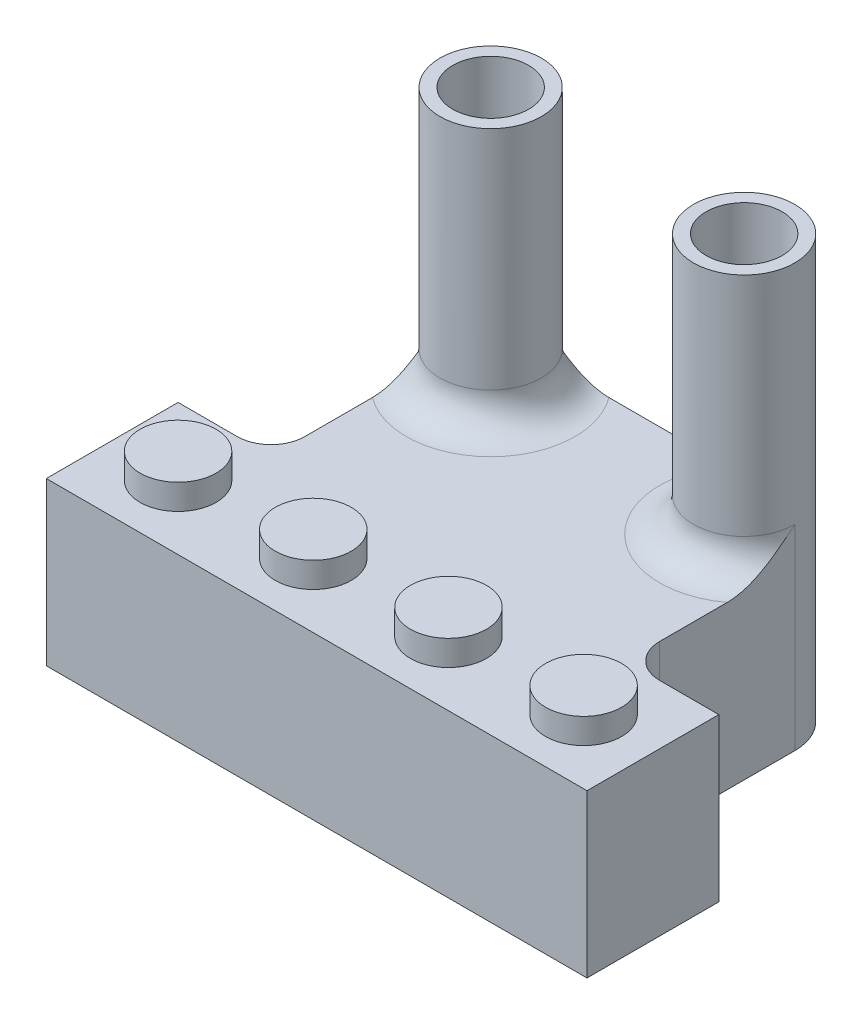
ISO-10303-21;
HEADER;
FILE_DESCRIPTION(('STEP AP214'),'2;1');
FILE_NAME('part.step','',(''),(''),'','','');
FILE_SCHEMA(('AUTOMOTIVE_DESIGN { 1 0 10303 214 1 1 1 1 }'));
ENDSEC;
DATA;
#1=APPLICATION_CONTEXT('core data for automotive mechanical design processes');
#2=APPLICATION_PROTOCOL_DEFINITION('international standard','automotive_design',2000,#1);
#3=PRODUCT_CONTEXT('',#1,'mechanical');
#4=PRODUCT('Part','Part','',(#3));
#5=PRODUCT_RELATED_PRODUCT_CATEGORY('part','',(#4));
#6=PRODUCT_DEFINITION_FORMATION('','',#4);
#7=PRODUCT_DEFINITION_CONTEXT('part definition',#1,'design');
#8=PRODUCT_DEFINITION('design','',#6,#7);
#9=PRODUCT_DEFINITION_SHAPE('','',#8);
#10=(LENGTH_UNIT() NAMED_UNIT(*) SI_UNIT(.MILLI.,.METRE.));
#11=(NAMED_UNIT(*) PLANE_ANGLE_UNIT() SI_UNIT($,.RADIAN.));
#12=(NAMED_UNIT(*) SI_UNIT($,.STERADIAN.) SOLID_ANGLE_UNIT());
#13=UNCERTAINTY_MEASURE_WITH_UNIT(LENGTH_MEASURE(1.E-05),#10,'distance_accuracy_value','');
#14=(GEOMETRIC_REPRESENTATION_CONTEXT(3) GLOBAL_UNCERTAINTY_ASSIGNED_CONTEXT((#13)) GLOBAL_UNIT_ASSIGNED_CONTEXT((#10,
#11,#12)) REPRESENTATION_CONTEXT('',''));
#15=CARTESIAN_POINT('',(0.,0.,0.));
#16=DIRECTION('',(0.,0.,1.));
#17=DIRECTION('',(1.,0.,0.));
#18=AXIS2_PLACEMENT_3D('',#15,#16,#17);
#19=CARTESIAN_POINT('',(236.873836495771,9.27344124698602,-50.3698911744964));
#20=DIRECTION('',(0.,0.,-1.));
#21=DIRECTION('',(-1.,0.,0.));
#22=AXIS2_PLACEMENT_3D('',#19,#20,#21);
#23=PLANE('',#22);
#24=DIRECTION('',(1.,0.,0.));
#25=VECTOR('',#24,1.);
#26=CARTESIAN_POINT('',(236.873836495771,-0.32655875301398,-50.3698911744964));
#27=LINE('',#26,#25);
#28=CARTESIAN_POINT('',(265.373836495771,-0.32655875301398,-50.3698911744964));
#29=VERTEX_POINT('',#28);
#30=CARTESIAN_POINT('',(268.873836495771,-0.32655875301398,-50.3698911744964));
#31=VERTEX_POINT('',#30);
#32=EDGE_CURVE('E344',#29,#31,#27,.T.);
#33=ORIENTED_EDGE('',*,*,#32,.F.);
#34=DIRECTION('',(0.,-1.,0.));
#35=VECTOR('',#34,1.);
#36=CARTESIAN_POINT('',(265.373836495771,9.27344124698602,-50.3698911744964));
#37=LINE('',#36,#35);
#38=CARTESIAN_POINT('',(265.373836495771,9.27344124698602,-50.3698911744964));
#39=VERTEX_POINT('',#38);
#40=EDGE_CURVE('E373',#29,#39,#37,.F.);
#41=ORIENTED_EDGE('',*,*,#40,.T.);
#42=DIRECTION('',(1.,0.,0.));
#43=VECTOR('',#42,1.);
#44=CARTESIAN_POINT('',(236.873836495771,9.27344124698602,-50.3698911744964));
#45=LINE('',#44,#43);
#46=CARTESIAN_POINT('',(268.873836495771,9.27344124698602,-50.3698911744964));
#47=VERTEX_POINT('',#46);
#48=EDGE_CURVE('E331',#39,#47,#45,.T.);
#49=ORIENTED_EDGE('',*,*,#48,.T.);
#50=DIRECTION('',(0.,-1.,0.));
#51=VECTOR('',#50,1.);
#52=CARTESIAN_POINT('',(268.873836495771,9.27344124698602,-50.3698911744964));
#53=LINE('',#52,#51);
#54=EDGE_CURVE('E348',#47,#31,#53,.T.);
#55=ORIENTED_EDGE('',*,*,#54,.T.);
#56=EDGE_LOOP('',(#33,#41,#49,#55));
#57=FACE_BOUND('',#56,.T.);
#58=ADVANCED_FACE('F113',(#57),#23,.T.);
#59=CARTESIAN_POINT('',(0.,9.27344124698602,0.));
#60=DIRECTION('',(0.,1.,0.));
#61=DIRECTION('',(0.,0.,1.));
#62=AXIS2_PLACEMENT_3D('',#59,#60,#61);
#63=PLANE('',#62);
#64=DIRECTION('',(1.,0.,0.));
#65=VECTOR('',#64,1.);
#66=CARTESIAN_POINT('',(0.,9.27344124698602,-63.3698911744964));
#67=LINE('',#66,#65);
#68=CARTESIAN_POINT('',(249.37383649577,9.27344124698602,-63.3698911744964));
#69=VERTEX_POINT('',#68);
#70=CARTESIAN_POINT('',(256.373836495771,9.27344124698602,-63.3698911744964));
#71=VERTEX_POINT('',#70);
#72=EDGE_CURVE('E264',#69,#71,#67,.T.);
#73=ORIENTED_EDGE('',*,*,#72,.F.);
#74=CARTESIAN_POINT('',(245.373836495771,9.27344124698602,-60.3698911744964));
#75=DIRECTION('',(0.,1.,0.));
#76=DIRECTION('',(0.,0.,1.));
#77=AXIS2_PLACEMENT_3D('',#74,#75,#76);
#78=CIRCLE('',#77,4.99999999999988);
#79=CARTESIAN_POINT('',(242.373836495771,9.27344124698602,-56.3698911744966));
#80=VERTEX_POINT('',#79);
#81=EDGE_CURVE('E366',#69,#80,#78,.F.);
#82=ORIENTED_EDGE('',*,*,#81,.T.);
#83=DIRECTION('',(0.,0.,-1.));
#84=VECTOR('',#83,1.);
#85=CARTESIAN_POINT('',(242.373836495771,9.27344124698602,0.));
#86=LINE('',#85,#84);
#87=CARTESIAN_POINT('',(242.373836495771,9.27344124698602,-52.3698911744964));
#88=VERTEX_POINT('',#87);
#89=EDGE_CURVE('E267',#88,#80,#86,.T.);
#90=ORIENTED_EDGE('',*,*,#89,.F.);
#91=CARTESIAN_POINT('',(240.373836495771,9.27344124698602,-52.3698911744964));
#92=DIRECTION('',(0.,1.,0.));
#93=DIRECTION('',(0.,0.,1.));
#94=AXIS2_PLACEMENT_3D('',#91,#92,#93);
#95=CIRCLE('',#94,2.);
#96=CARTESIAN_POINT('',(240.373836495771,9.27344124698602,-50.3698911744964));
#97=VERTEX_POINT('',#96);
#98=EDGE_CURVE('E377',#88,#97,#95,.F.);
#99=ORIENTED_EDGE('',*,*,#98,.T.);
#100=CARTESIAN_POINT('',(236.873836495771,9.27344124698602,-50.3698911744964));
#101=VERTEX_POINT('',#100);
#102=EDGE_CURVE('E332',#101,#97,#45,.T.);
#103=ORIENTED_EDGE('',*,*,#102,.F.);
#104=DIRECTION('',(0.,0.,1.));
#105=VECTOR('',#104,1.);
#106=CARTESIAN_POINT('',(236.873836495771,9.27344124698602,-50.3698911744964));
#107=LINE('',#106,#105);
#108=CARTESIAN_POINT('',(236.873836495771,9.27344124698602,-42.5698911744964));
#109=VERTEX_POINT('',#108);
#110=EDGE_CURVE('E322',#101,#109,#107,.T.);
#111=ORIENTED_EDGE('',*,*,#110,.T.);
#112=DIRECTION('',(1.,0.,0.));
#113=VECTOR('',#112,1.);
#114=CARTESIAN_POINT('',(236.873836495771,9.27344124698602,-42.5698911744964));
#115=LINE('',#114,#113);
#116=CARTESIAN_POINT('',(268.873836495771,9.27344124698602,-42.5698911744964));
#117=VERTEX_POINT('',#116);
#118=EDGE_CURVE('E325',#109,#117,#115,.T.);
#119=ORIENTED_EDGE('',*,*,#118,.T.);
#120=DIRECTION('',(0.,0.,1.));
#121=VECTOR('',#120,1.);
#122=CARTESIAN_POINT('',(268.873836495771,9.27344124698602,-50.3698911744964));
#123=LINE('',#122,#121);
#124=EDGE_CURVE('E328',#47,#117,#123,.T.);
#125=ORIENTED_EDGE('',*,*,#124,.F.);
#126=ORIENTED_EDGE('',*,*,#48,.F.);
#127=CARTESIAN_POINT('',(265.373836495771,9.27344124698602,-52.3698911744964));
#128=DIRECTION('',(0.,1.,0.));
#129=DIRECTION('',(0.,0.,1.));
#130=AXIS2_PLACEMENT_3D('',#127,#128,#129);
#131=CIRCLE('',#130,2.);
#132=CARTESIAN_POINT('',(263.373836495771,9.27344124698602,-52.3698911744964));
#133=VERTEX_POINT('',#132);
#134=EDGE_CURVE('E12',#39,#133,#131,.F.);
#135=ORIENTED_EDGE('',*,*,#134,.T.);
#136=DIRECTION('',(0.,0.,1.));
#137=VECTOR('',#136,1.);
#138=CARTESIAN_POINT('',(263.373836495771,9.27344124698602,0.));
#139=LINE('',#138,#137);
#140=CARTESIAN_POINT('',(263.373836495771,9.27344124698602,-56.3698911744966));
#141=VERTEX_POINT('',#140);
#142=EDGE_CURVE('E270',#141,#133,#139,.T.);
#143=ORIENTED_EDGE('',*,*,#142,.F.);
#144=CARTESIAN_POINT('',(260.373836495771,9.27344124698602,-60.3698911744964));
#145=DIRECTION('',(0.,1.,0.));
#146=DIRECTION('',(0.,0.,1.));
#147=AXIS2_PLACEMENT_3D('',#144,#145,#146);
#148=CIRCLE('',#147,4.99999999999988);
#149=EDGE_CURVE('E363',#141,#71,#148,.F.);
#150=ORIENTED_EDGE('',*,*,#149,.T.);
#151=EDGE_LOOP('',(#73,#82,#90,#99,#103,#111,#119,#125,#126,#135,#143,#150));
#152=FACE_BOUND('',#151,.T.);
#153=CARTESIAN_POINT('',(240.873836495771,9.27344124698602,-46.3698911744964));
#154=DIRECTION('',(0.,1.,0.));
#155=DIRECTION('',(0.,0.,1.));
#156=AXIS2_PLACEMENT_3D('',#153,#154,#155);
#157=CIRCLE('',#156,2.25000000000001);
#158=CARTESIAN_POINT('',(240.873836495771,9.27344124698602,-44.1198911744964));
#159=VERTEX_POINT('',#158);
#160=EDGE_CURVE('E278',#159,#159,#157,.T.);
#161=ORIENTED_EDGE('',*,*,#160,.F.);
#162=EDGE_LOOP('',(#161));
#163=FACE_BOUND('',#162,.T.);
#164=CARTESIAN_POINT('',(264.873836495771,9.27344124698602,-46.3698911744964));
#165=DIRECTION('',(0.,1.,0.));
#166=DIRECTION('',(0.,0.,1.));
#167=AXIS2_PLACEMENT_3D('',#164,#165,#166);
#168=CIRCLE('',#167,2.24999999999995);
#169=CARTESIAN_POINT('',(264.873836495771,9.27344124698602,-44.1198911744965));
#170=VERTEX_POINT('',#169);
#171=EDGE_CURVE('E273',#170,#170,#168,.T.);
#172=ORIENTED_EDGE('',*,*,#171,.F.);
#173=EDGE_LOOP('',(#172));
#174=FACE_BOUND('',#173,.T.);
#175=CARTESIAN_POINT('',(256.873836495771,9.27344124698602,-46.3698911744964));
#176=DIRECTION('',(0.,1.,0.));
#177=DIRECTION('',(0.,0.,1.));
#178=AXIS2_PLACEMENT_3D('',#175,#176,#177);
#179=CIRCLE('',#178,2.24999999999995);
#180=CARTESIAN_POINT('',(256.873836495771,9.27344124698602,-44.1198911744965));
#181=VERTEX_POINT('',#180);
#182=EDGE_CURVE('E255',#181,#181,#179,.T.);
#183=ORIENTED_EDGE('',*,*,#182,.F.);
#184=EDGE_LOOP('',(#183));
#185=FACE_BOUND('',#184,.T.);
#186=CARTESIAN_POINT('',(248.873836495771,9.27344124698602,-46.3698911744964));
#187=DIRECTION('',(0.,1.,0.));
#188=DIRECTION('',(0.,0.,1.));
#189=AXIS2_PLACEMENT_3D('',#186,#187,#188);
#190=CIRCLE('',#189,2.24999999999998);
#191=CARTESIAN_POINT('',(248.873836495771,9.27344124698602,-44.1198911744965));
#192=VERTEX_POINT('',#191);
#193=EDGE_CURVE('E284',#192,#192,#190,.T.);
#194=ORIENTED_EDGE('',*,*,#193,.F.);
#195=EDGE_LOOP('',(#194));
#196=FACE_BOUND('',#195,.T.);
#197=ADVANCED_FACE('F492',(#152,#163,#174,#185,#196),#63,.T.);
#198=CARTESIAN_POINT('',(236.873836495771,9.27344124698602,-50.3698911744964));
#199=DIRECTION('',(1.,0.,0.));
#200=DIRECTION('',(0.,0.,-1.));
#201=AXIS2_PLACEMENT_3D('',#198,#199,#200);
#202=PLANE('',#201);
#203=DIRECTION('',(0.,0.,1.));
#204=VECTOR('',#203,1.);
#205=CARTESIAN_POINT('',(236.873836495771,-0.32655875301398,-50.3698911744964));
#206=LINE('',#205,#204);
#207=CARTESIAN_POINT('',(236.873836495771,-0.32655875301398,-50.3698911744964));
#208=VERTEX_POINT('',#207);
#209=CARTESIAN_POINT('',(236.873836495771,-0.32655875301398,-42.5698911744964));
#210=VERTEX_POINT('',#209);
#211=EDGE_CURVE('E301',#208,#210,#206,.T.);
#212=ORIENTED_EDGE('',*,*,#211,.T.);
#213=DIRECTION('',(0.,-1.,0.));
#214=VECTOR('',#213,1.);
#215=CARTESIAN_POINT('',(236.873836495771,9.27344124698602,-42.5698911744964));
#216=LINE('',#215,#214);
#217=EDGE_CURVE('E293',#109,#210,#216,.T.);
#218=ORIENTED_EDGE('',*,*,#217,.F.);
#219=ORIENTED_EDGE('',*,*,#110,.F.);
#220=DIRECTION('',(0.,-1.,0.));
#221=VECTOR('',#220,1.);
#222=CARTESIAN_POINT('',(236.873836495771,9.27344124698602,-50.3698911744964));
#223=LINE('',#222,#221);
#224=EDGE_CURVE('E335',#101,#208,#223,.T.);
#225=ORIENTED_EDGE('',*,*,#224,.T.);
#226=EDGE_LOOP('',(#212,#218,#219,#225));
#227=FACE_BOUND('',#226,.T.);
#228=ADVANCED_FACE('F495',(#227),#202,.F.);
#229=CARTESIAN_POINT('',(236.873836495771,9.27344124698602,-42.5698911744964));
#230=DIRECTION('',(0.,0.,-1.));
#231=DIRECTION('',(-1.,0.,0.));
#232=AXIS2_PLACEMENT_3D('',#229,#230,#231);
#233=PLANE('',#232);
#234=DIRECTION('',(1.,0.,0.));
#235=VECTOR('',#234,1.);
#236=CARTESIAN_POINT('',(236.873836495771,-0.32655875301398,-42.5698911744964));
#237=LINE('',#236,#235);
#238=CARTESIAN_POINT('',(268.873836495771,-0.32655875301398,-42.5698911744964));
#239=VERTEX_POINT('',#238);
#240=EDGE_CURVE('E338',#210,#239,#237,.T.);
#241=ORIENTED_EDGE('',*,*,#240,.T.);
#242=DIRECTION('',(0.,-1.,0.));
#243=VECTOR('',#242,1.);
#244=CARTESIAN_POINT('',(268.873836495771,9.27344124698602,-42.5698911744964));
#245=LINE('',#244,#243);
#246=EDGE_CURVE('E351',#117,#239,#245,.T.);
#247=ORIENTED_EDGE('',*,*,#246,.F.);
#248=ORIENTED_EDGE('',*,*,#118,.F.);
#249=ORIENTED_EDGE('',*,*,#217,.T.);
#250=EDGE_LOOP('',(#241,#247,#248,#249));
#251=FACE_BOUND('',#250,.T.);
#252=ADVANCED_FACE('F507',(#251),#233,.F.);
#253=CARTESIAN_POINT('',(268.873836495771,9.27344124698602,-50.3698911744964));
#254=DIRECTION('',(1.,0.,0.));
#255=DIRECTION('',(0.,0.,-1.));
#256=AXIS2_PLACEMENT_3D('',#253,#254,#255);
#257=PLANE('',#256);
#258=DIRECTION('',(0.,0.,1.));
#259=VECTOR('',#258,1.);
#260=CARTESIAN_POINT('',(268.873836495771,-0.32655875301398,-50.3698911744964));
#261=LINE('',#260,#259);
#262=EDGE_CURVE('E341',#31,#239,#261,.T.);
#263=ORIENTED_EDGE('',*,*,#262,.F.);
#264=ORIENTED_EDGE('',*,*,#54,.F.);
#265=ORIENTED_EDGE('',*,*,#124,.T.);
#266=ORIENTED_EDGE('',*,*,#246,.T.);
#267=EDGE_LOOP('',(#263,#264,#265,#266));
#268=FACE_BOUND('',#267,.T.);
#269=ADVANCED_FACE('F503',(#268),#257,.T.);
#270=ORIENTED_EDGE('',*,*,#102,.T.);
#271=DIRECTION('',(0.,-1.,0.));
#272=VECTOR('',#271,1.);
#273=CARTESIAN_POINT('',(240.373836495771,-0.32655875301398,-50.3698911744964));
#274=LINE('',#273,#272);
#275=CARTESIAN_POINT('',(240.373836495771,-0.32655875301398,-50.3698911744964));
#276=VERTEX_POINT('',#275);
#277=EDGE_CURVE('E357',#97,#276,#274,.T.);
#278=ORIENTED_EDGE('',*,*,#277,.T.);
#279=EDGE_CURVE('E326',#208,#276,#27,.T.);
#280=ORIENTED_EDGE('',*,*,#279,.F.);
#281=ORIENTED_EDGE('',*,*,#224,.F.);
#282=EDGE_LOOP('',(#270,#278,#280,#281));
#283=FACE_BOUND('',#282,.T.);
#284=ADVANCED_FACE('F500',(#283),#23,.T.);
#285=CARTESIAN_POINT('',(0.,-0.32655875301398,0.));
#286=DIRECTION('',(0.,1.,0.));
#287=DIRECTION('',(0.,0.,1.));
#288=AXIS2_PLACEMENT_3D('',#285,#286,#287);
#289=PLANE('',#288);
#290=DIRECTION('',(1.,0.,0.));
#291=VECTOR('',#290,1.);
#292=CARTESIAN_POINT('',(0.,-0.32655875301398,-63.3698911744964));
#293=LINE('',#292,#291);
#294=CARTESIAN_POINT('',(245.373836495771,-0.32655875301398,-63.3698911744964));
#295=VERTEX_POINT('',#294);
#296=CARTESIAN_POINT('',(260.373836495771,-0.32655875301398,-63.3698911744964));
#297=VERTEX_POINT('',#296);
#298=EDGE_CURVE('E211',#295,#297,#293,.T.);
#299=ORIENTED_EDGE('',*,*,#298,.T.);
#300=CARTESIAN_POINT('',(260.373836495771,-0.32655875301398,-60.3698911744964));
#301=DIRECTION('',(0.,1.,0.));
#302=DIRECTION('',(0.,0.,1.));
#303=AXIS2_PLACEMENT_3D('',#300,#301,#302);
#304=CIRCLE('',#303,2.99999999999988);
#305=CARTESIAN_POINT('',(263.373836495771,-0.32655875301398,-60.3698911744964));
#306=VERTEX_POINT('',#305);
#307=EDGE_CURVE('E221',#306,#297,#304,.T.);
#308=ORIENTED_EDGE('',*,*,#307,.F.);
#309=DIRECTION('',(0.,0.,1.));
#310=VECTOR('',#309,1.);
#311=CARTESIAN_POINT('',(263.373836495771,-0.32655875301398,0.));
#312=LINE('',#311,#310);
#313=CARTESIAN_POINT('',(263.373836495771,-0.32655875301398,-52.3698911744964));
#314=VERTEX_POINT('',#313);
#315=EDGE_CURVE('E260',#306,#314,#312,.T.);
#316=ORIENTED_EDGE('',*,*,#315,.T.);
#317=CARTESIAN_POINT('',(265.373836495771,-0.326558753013982,-52.3698911744964));
#318=DIRECTION('',(0.,1.,0.));
#319=DIRECTION('',(0.,0.,1.));
#320=AXIS2_PLACEMENT_3D('',#317,#318,#319);
#321=CIRCLE('',#320,2.);
#322=EDGE_CURVE('E121',#314,#29,#321,.T.);
#323=ORIENTED_EDGE('',*,*,#322,.T.);
#324=ORIENTED_EDGE('',*,*,#32,.T.);
#325=ORIENTED_EDGE('',*,*,#262,.T.);
#326=ORIENTED_EDGE('',*,*,#240,.F.);
#327=ORIENTED_EDGE('',*,*,#211,.F.);
#328=ORIENTED_EDGE('',*,*,#279,.T.);
#329=CARTESIAN_POINT('',(240.373836495771,-0.32655875301398,-52.3698911744964));
#330=DIRECTION('',(0.,1.,0.));
#331=DIRECTION('',(0.,0.,1.));
#332=AXIS2_PLACEMENT_3D('',#329,#330,#331);
#333=CIRCLE('',#332,2.);
#334=CARTESIAN_POINT('',(242.373836495771,-0.32655875301398,-52.3698911744964));
#335=VERTEX_POINT('',#334);
#336=EDGE_CURVE('E375',#276,#335,#333,.T.);
#337=ORIENTED_EDGE('',*,*,#336,.T.);
#338=DIRECTION('',(0.,0.,-1.));
#339=VECTOR('',#338,1.);
#340=CARTESIAN_POINT('',(242.373836495771,-0.32655875301398,0.));
#341=LINE('',#340,#339);
#342=CARTESIAN_POINT('',(242.373836495771,-0.32655875301398,-60.3698911744964));
#343=VERTEX_POINT('',#342);
#344=EDGE_CURVE('E222',#335,#343,#341,.T.);
#345=ORIENTED_EDGE('',*,*,#344,.T.);
#346=CARTESIAN_POINT('',(245.373836495771,-0.32655875301398,-60.3698911744964));
#347=DIRECTION('',(0.,1.,0.));
#348=DIRECTION('',(0.,0.,1.));
#349=AXIS2_PLACEMENT_3D('',#346,#347,#348);
#350=CIRCLE('',#349,2.99999999999988);
#351=EDGE_CURVE('E228',#295,#343,#350,.T.);
#352=ORIENTED_EDGE('',*,*,#351,.F.);
#353=EDGE_LOOP('',(#299,#308,#316,#323,#324,#325,#326,#327,#328,#337,#345,#352));
#354=FACE_BOUND('',#353,.T.);
#355=CARTESIAN_POINT('',(264.873836495771,-0.32655875301398,-46.3698911744964));
#356=DIRECTION('',(0.,1.,0.));
#357=DIRECTION('',(0.,0.,1.));
#358=AXIS2_PLACEMENT_3D('',#355,#356,#357);
#359=CIRCLE('',#358,2.54999999999999);
#360=CARTESIAN_POINT('',(264.873836495771,-0.32655875301398,-43.8198911744965));
#361=VERTEX_POINT('',#360);
#362=EDGE_CURVE('E302',#361,#361,#359,.T.);
#363=ORIENTED_EDGE('',*,*,#362,.T.);
#364=EDGE_LOOP('',(#363));
#365=FACE_BOUND('',#364,.T.);
#366=CARTESIAN_POINT('',(256.873836495771,-0.32655875301398,-46.3698911744964));
#367=DIRECTION('',(0.,1.,0.));
#368=DIRECTION('',(0.,0.,1.));
#369=AXIS2_PLACEMENT_3D('',#366,#367,#368);
#370=CIRCLE('',#369,2.54999999999999);
#371=CARTESIAN_POINT('',(256.873836495771,-0.32655875301398,-43.8198911744965));
#372=VERTEX_POINT('',#371);
#373=EDGE_CURVE('E305',#372,#372,#370,.T.);
#374=ORIENTED_EDGE('',*,*,#373,.T.);
#375=EDGE_LOOP('',(#374));
#376=FACE_BOUND('',#375,.T.);
#377=CARTESIAN_POINT('',(248.873836495771,-0.32655875301398,-46.3698911744964));
#378=DIRECTION('',(0.,1.,0.));
#379=DIRECTION('',(0.,0.,1.));
#380=AXIS2_PLACEMENT_3D('',#377,#378,#379);
#381=CIRCLE('',#380,2.54999999999996);
#382=CARTESIAN_POINT('',(248.873836495771,-0.32655875301398,-43.8198911744965));
#383=VERTEX_POINT('',#382);
#384=EDGE_CURVE('E311',#383,#383,#381,.T.);
#385=ORIENTED_EDGE('',*,*,#384,.T.);
#386=EDGE_LOOP('',(#385));
#387=FACE_BOUND('',#386,.T.);
#388=CARTESIAN_POINT('',(240.873836495771,-0.32655875301398,-46.3698911744964));
#389=DIRECTION('',(0.,1.,0.));
#390=DIRECTION('',(0.,0.,1.));
#391=AXIS2_PLACEMENT_3D('',#388,#389,#390);
#392=CIRCLE('',#391,2.54999999999996);
#393=CARTESIAN_POINT('',(240.873836495771,-0.32655875301398,-43.8198911744965));
#394=VERTEX_POINT('',#393);
#395=EDGE_CURVE('E317',#394,#394,#392,.T.);
#396=ORIENTED_EDGE('',*,*,#395,.T.);
#397=EDGE_LOOP('',(#396));
#398=FACE_BOUND('',#397,.T.);
#399=ADVANCED_FACE('F233',(#354,#365,#376,#387,#398),#289,.F.);
#400=CARTESIAN_POINT('',(240.873836495771,1.37344124698602,-46.3698911744964));
#401=DIRECTION('',(0.,-1.,0.));
#402=DIRECTION('',(0.,0.,-1.));
#403=AXIS2_PLACEMENT_3D('',#400,#401,#402);
#404=CYLINDRICAL_SURFACE('',#403,2.54999999999996);
#405=CARTESIAN_POINT('',(240.873836495771,1.37344124698602,-46.3698911744964));
#406=DIRECTION('',(0.,1.,0.));
#407=DIRECTION('',(0.,0.,1.));
#408=AXIS2_PLACEMENT_3D('',#405,#406,#407);
#409=CIRCLE('',#408,2.54999999999996);
#410=CARTESIAN_POINT('',(240.873836495771,1.37344124698602,-43.8198911744965));
#411=VERTEX_POINT('',#410);
#412=EDGE_CURVE('E277',#411,#411,#409,.T.);
#413=ORIENTED_EDGE('',*,*,#412,.T.);
#414=EDGE_LOOP('',(#413));
#415=FACE_BOUND('',#414,.T.);
#416=ORIENTED_EDGE('',*,*,#395,.F.);
#417=EDGE_LOOP('',(#416));
#418=FACE_BOUND('',#417,.T.);
#419=ADVANCED_FACE('F485',(#415,#418),#404,.F.);
#420=CARTESIAN_POINT('',(240.873836495771,1.37344124698602,-46.3698911744964));
#421=DIRECTION('',(0.,1.,0.));
#422=DIRECTION('',(0.,0.,1.));
#423=AXIS2_PLACEMENT_3D('',#420,#421,#422);
#424=PLANE('',#423);
#425=ORIENTED_EDGE('',*,*,#412,.F.);
#426=EDGE_LOOP('',(#425));
#427=FACE_BOUND('',#426,.T.);
#428=ADVANCED_FACE('F480',(#427),#424,.F.);
#429=CARTESIAN_POINT('',(248.873836495771,1.37344124698602,-46.3698911744964));
#430=DIRECTION('',(0.,-1.,0.));
#431=DIRECTION('',(0.,0.,-1.));
#432=AXIS2_PLACEMENT_3D('',#429,#430,#431);
#433=CYLINDRICAL_SURFACE('',#432,2.54999999999996);
#434=CARTESIAN_POINT('',(248.873836495771,1.37344124698602,-46.3698911744964));
#435=DIRECTION('',(0.,1.,0.));
#436=DIRECTION('',(0.,0.,1.));
#437=AXIS2_PLACEMENT_3D('',#434,#435,#436);
#438=CIRCLE('',#437,2.54999999999996);
#439=CARTESIAN_POINT('',(248.873836495771,1.37344124698602,-43.8198911744965));
#440=VERTEX_POINT('',#439);
#441=EDGE_CURVE('E314',#440,#440,#438,.T.);
#442=ORIENTED_EDGE('',*,*,#441,.T.);
#443=EDGE_LOOP('',(#442));
#444=FACE_BOUND('',#443,.T.);
#445=ORIENTED_EDGE('',*,*,#384,.F.);
#446=EDGE_LOOP('',(#445));
#447=FACE_BOUND('',#446,.T.);
#448=ADVANCED_FACE('F477',(#444,#447),#433,.F.);
#449=CARTESIAN_POINT('',(248.873836495771,1.37344124698602,-46.3698911744964));
#450=DIRECTION('',(0.,1.,0.));
#451=DIRECTION('',(0.,0.,1.));
#452=AXIS2_PLACEMENT_3D('',#449,#450,#451);
#453=PLANE('',#452);
#454=ORIENTED_EDGE('',*,*,#441,.F.);
#455=EDGE_LOOP('',(#454));
#456=FACE_BOUND('',#455,.T.);
#457=ADVANCED_FACE('F472',(#456),#453,.F.);
#458=CARTESIAN_POINT('',(256.873836495771,1.37344124698602,-46.3698911744964));
#459=DIRECTION('',(0.,-1.,0.));
#460=DIRECTION('',(0.,0.,-1.));
#461=AXIS2_PLACEMENT_3D('',#458,#459,#460);
#462=CYLINDRICAL_SURFACE('',#461,2.54999999999999);
#463=CARTESIAN_POINT('',(256.873836495771,1.37344124698602,-46.3698911744964));
#464=DIRECTION('',(0.,1.,0.));
#465=DIRECTION('',(0.,0.,1.));
#466=AXIS2_PLACEMENT_3D('',#463,#464,#465);
#467=CIRCLE('',#466,2.54999999999999);
#468=CARTESIAN_POINT('',(256.873836495771,1.37344124698602,-43.8198911744965));
#469=VERTEX_POINT('',#468);
#470=EDGE_CURVE('E308',#469,#469,#467,.T.);
#471=ORIENTED_EDGE('',*,*,#470,.T.);
#472=EDGE_LOOP('',(#471));
#473=FACE_BOUND('',#472,.T.);
#474=ORIENTED_EDGE('',*,*,#373,.F.);
#475=EDGE_LOOP('',(#474));
#476=FACE_BOUND('',#475,.T.);
#477=ADVANCED_FACE('F469',(#473,#476),#462,.F.);
#478=CARTESIAN_POINT('',(256.873836495771,1.37344124698602,-46.3698911744964));
#479=DIRECTION('',(0.,1.,0.));
#480=DIRECTION('',(0.,0.,1.));
#481=AXIS2_PLACEMENT_3D('',#478,#479,#480);
#482=PLANE('',#481);
#483=ORIENTED_EDGE('',*,*,#470,.F.);
#484=EDGE_LOOP('',(#483));
#485=FACE_BOUND('',#484,.T.);
#486=ADVANCED_FACE('F467',(#485),#482,.F.);
#487=CARTESIAN_POINT('',(264.873836495771,1.37344124698602,-46.3698911744964));
#488=DIRECTION('',(0.,-1.,0.));
#489=DIRECTION('',(0.,0.,-1.));
#490=AXIS2_PLACEMENT_3D('',#487,#488,#489);
#491=CYLINDRICAL_SURFACE('',#490,2.54999999999999);
#492=CARTESIAN_POINT('',(264.873836495771,1.37344124698602,-46.3698911744964));
#493=DIRECTION('',(0.,1.,0.));
#494=DIRECTION('',(0.,0.,1.));
#495=AXIS2_PLACEMENT_3D('',#492,#493,#494);
#496=CIRCLE('',#495,2.54999999999999);
#497=CARTESIAN_POINT('',(264.873836495771,1.37344124698602,-43.8198911744965));
#498=VERTEX_POINT('',#497);
#499=EDGE_CURVE('E298',#498,#498,#496,.T.);
#500=ORIENTED_EDGE('',*,*,#499,.T.);
#501=EDGE_LOOP('',(#500));
#502=FACE_BOUND('',#501,.T.);
#503=ORIENTED_EDGE('',*,*,#362,.F.);
#504=EDGE_LOOP('',(#503));
#505=FACE_BOUND('',#504,.T.);
#506=ADVANCED_FACE('F463',(#502,#505),#491,.F.);
#507=CARTESIAN_POINT('',(264.873836495771,1.37344124698602,-46.3698911744964));
#508=DIRECTION('',(0.,1.,0.));
#509=DIRECTION('',(0.,0.,1.));
#510=AXIS2_PLACEMENT_3D('',#507,#508,#509);
#511=PLANE('',#510);
#512=ORIENTED_EDGE('',*,*,#499,.F.);
#513=EDGE_LOOP('',(#512));
#514=FACE_BOUND('',#513,.T.);
#515=ADVANCED_FACE('F459',(#514),#511,.F.);
#516=CARTESIAN_POINT('',(264.873836495771,10.773441246986,-46.3698911744964));
#517=DIRECTION('',(0.,-1.,0.));
#518=DIRECTION('',(0.,0.,-1.));
#519=AXIS2_PLACEMENT_3D('',#516,#517,#518);
#520=CYLINDRICAL_SURFACE('',#519,2.24999999999995);
#521=CARTESIAN_POINT('',(264.873836495771,10.773441246986,-46.3698911744964));
#522=DIRECTION('',(0.,1.,0.));
#523=DIRECTION('',(0.,0.,1.));
#524=AXIS2_PLACEMENT_3D('',#521,#522,#523);
#525=CIRCLE('',#524,2.24999999999995);
#526=CARTESIAN_POINT('',(264.873836495771,10.773441246986,-44.1198911744965));
#527=VERTEX_POINT('',#526);
#528=EDGE_CURVE('E290',#527,#527,#525,.T.);
#529=ORIENTED_EDGE('',*,*,#528,.F.);
#530=EDGE_LOOP('',(#529));
#531=FACE_BOUND('',#530,.T.);
#532=ORIENTED_EDGE('',*,*,#171,.T.);
#533=EDGE_LOOP('',(#532));
#534=FACE_BOUND('',#533,.T.);
#535=ADVANCED_FACE('F455',(#531,#534),#520,.T.);
#536=CARTESIAN_POINT('',(264.873836495771,10.773441246986,-46.3698911744964));
#537=DIRECTION('',(0.,1.,0.));
#538=DIRECTION('',(0.,0.,1.));
#539=AXIS2_PLACEMENT_3D('',#536,#537,#538);
#540=PLANE('',#539);
#541=ORIENTED_EDGE('',*,*,#528,.T.);
#542=EDGE_LOOP('',(#541));
#543=FACE_BOUND('',#542,.T.);
#544=ADVANCED_FACE('F445',(#543),#540,.T.);
#545=CARTESIAN_POINT('',(248.873836495771,10.773441246986,-46.3698911744964));
#546=DIRECTION('',(0.,-1.,0.));
#547=DIRECTION('',(0.,0.,-1.));
#548=AXIS2_PLACEMENT_3D('',#545,#546,#547);
#549=CYLINDRICAL_SURFACE('',#548,2.24999999999998);
#550=CARTESIAN_POINT('',(248.873836495771,10.773441246986,-46.3698911744964));
#551=DIRECTION('',(0.,1.,0.));
#552=DIRECTION('',(0.,0.,1.));
#553=AXIS2_PLACEMENT_3D('',#550,#551,#552);
#554=CIRCLE('',#553,2.24999999999998);
#555=CARTESIAN_POINT('',(248.873836495771,10.773441246986,-44.1198911744965));
#556=VERTEX_POINT('',#555);
#557=EDGE_CURVE('E281',#556,#556,#554,.T.);
#558=ORIENTED_EDGE('',*,*,#557,.F.);
#559=EDGE_LOOP('',(#558));
#560=FACE_BOUND('',#559,.T.);
#561=ORIENTED_EDGE('',*,*,#193,.T.);
#562=EDGE_LOOP('',(#561));
#563=FACE_BOUND('',#562,.T.);
#564=ADVANCED_FACE('F441',(#560,#563),#549,.T.);
#565=CARTESIAN_POINT('',(248.873836495771,10.773441246986,-46.3698911744964));
#566=DIRECTION('',(0.,1.,0.));
#567=DIRECTION('',(0.,0.,1.));
#568=AXIS2_PLACEMENT_3D('',#565,#566,#567);
#569=PLANE('',#568);
#570=ORIENTED_EDGE('',*,*,#557,.T.);
#571=EDGE_LOOP('',(#570));
#572=FACE_BOUND('',#571,.T.);
#573=ADVANCED_FACE('F437',(#572),#569,.T.);
#574=CARTESIAN_POINT('',(240.873836495771,10.773441246986,-46.3698911744964));
#575=DIRECTION('',(0.,-1.,0.));
#576=DIRECTION('',(0.,0.,-1.));
#577=AXIS2_PLACEMENT_3D('',#574,#575,#576);
#578=CYLINDRICAL_SURFACE('',#577,2.25000000000001);
#579=CARTESIAN_POINT('',(240.873836495771,10.773441246986,-46.3698911744964));
#580=DIRECTION('',(0.,1.,0.));
#581=DIRECTION('',(0.,0.,1.));
#582=AXIS2_PLACEMENT_3D('',#579,#580,#581);
#583=CIRCLE('',#582,2.25000000000001);
#584=CARTESIAN_POINT('',(240.873836495771,10.773441246986,-44.1198911744964));
#585=VERTEX_POINT('',#584);
#586=EDGE_CURVE('E274',#585,#585,#583,.T.);
#587=ORIENTED_EDGE('',*,*,#586,.F.);
#588=EDGE_LOOP('',(#587));
#589=FACE_BOUND('',#588,.T.);
#590=ORIENTED_EDGE('',*,*,#160,.T.);
#591=EDGE_LOOP('',(#590));
#592=FACE_BOUND('',#591,.T.);
#593=ADVANCED_FACE('F433',(#589,#592),#578,.T.);
#594=CARTESIAN_POINT('',(240.873836495771,10.773441246986,-46.3698911744964));
#595=DIRECTION('',(0.,1.,0.));
#596=DIRECTION('',(0.,0.,1.));
#597=AXIS2_PLACEMENT_3D('',#594,#595,#596);
#598=PLANE('',#597);
#599=ORIENTED_EDGE('',*,*,#586,.T.);
#600=EDGE_LOOP('',(#599));
#601=FACE_BOUND('',#600,.T.);
#602=ADVANCED_FACE('F429',(#601),#598,.T.);
#603=CARTESIAN_POINT('',(256.873836495771,10.773441246986,-46.3698911744964));
#604=DIRECTION('',(0.,-1.,0.));
#605=DIRECTION('',(0.,0.,-1.));
#606=AXIS2_PLACEMENT_3D('',#603,#604,#605);
#607=CYLINDRICAL_SURFACE('',#606,2.24999999999995);
#608=CARTESIAN_POINT('',(256.873836495771,10.773441246986,-46.3698911744964));
#609=DIRECTION('',(0.,1.,0.));
#610=DIRECTION('',(0.,0.,1.));
#611=AXIS2_PLACEMENT_3D('',#608,#609,#610);
#612=CIRCLE('',#611,2.24999999999995);
#613=CARTESIAN_POINT('',(256.873836495771,10.773441246986,-44.1198911744965));
#614=VERTEX_POINT('',#613);
#615=EDGE_CURVE('E287',#614,#614,#612,.T.);
#616=ORIENTED_EDGE('',*,*,#615,.F.);
#617=EDGE_LOOP('',(#616));
#618=FACE_BOUND('',#617,.T.);
#619=ORIENTED_EDGE('',*,*,#182,.T.);
#620=EDGE_LOOP('',(#619));
#621=FACE_BOUND('',#620,.T.);
#622=ADVANCED_FACE('F432',(#618,#621),#607,.T.);
#623=CARTESIAN_POINT('',(256.873836495771,10.773441246986,-46.3698911744964));
#624=DIRECTION('',(0.,1.,0.));
#625=DIRECTION('',(0.,0.,1.));
#626=AXIS2_PLACEMENT_3D('',#623,#624,#625);
#627=PLANE('',#626);
#628=ORIENTED_EDGE('',*,*,#615,.T.);
#629=EDGE_LOOP('',(#628));
#630=FACE_BOUND('',#629,.T.);
#631=ADVANCED_FACE('F426',(#630),#627,.T.);
#632=CARTESIAN_POINT('',(263.373836495771,47.439394660991,0.));
#633=DIRECTION('',(1.,0.,0.));
#634=DIRECTION('',(0.,0.,-1.));
#635=AXIS2_PLACEMENT_3D('',#632,#633,#634);
#636=PLANE('',#635);
#637=ORIENTED_EDGE('',*,*,#142,.T.);
#638=DIRECTION('',(0.,-1.,0.));
#639=VECTOR('',#638,1.);
#640=CARTESIAN_POINT('',(263.373836495771,-0.326558753013982,-52.3698911744964));
#641=LINE('',#640,#639);
#642=EDGE_CURVE('E371',#133,#314,#641,.T.);
#643=ORIENTED_EDGE('',*,*,#642,.T.);
#644=ORIENTED_EDGE('',*,*,#315,.F.);
#645=DIRECTION('',(0.,-1.,0.));
#646=VECTOR('',#645,1.);
#647=CARTESIAN_POINT('',(263.373836495771,47.439394660991,-60.3698911744964));
#648=LINE('',#647,#646);
#649=CARTESIAN_POINT('',(263.373836495771,11.273441246986,-60.3698911744964));
#650=VERTEX_POINT('',#649);
#651=EDGE_CURVE('E258',#650,#306,#648,.T.);
#652=ORIENTED_EDGE('',*,*,#651,.F.);
#653=CARTESIAN_POINT('',(263.373836495771,9.27344124698602,-56.3698911744966));
#654=CARTESIAN_POINT('',(263.373836495771,9.27344779261347,-56.5401556263429));
#655=CARTESIAN_POINT('',(263.373836495771,9.28732654200864,-56.7097792927822));
#656=CARTESIAN_POINT('',(263.373836495771,9.33853436966069,-57.0438223663824));
#657=CARTESIAN_POINT('',(263.373836495771,9.37563077044069,-57.2082766052513));
#658=CARTESIAN_POINT('',(263.373836495771,9.50330254732682,-57.6495915043533));
#659=CARTESIAN_POINT('',(263.373836495771,9.61314843524042,-57.9207864731447));
#660=CARTESIAN_POINT('',(263.373836495771,9.87248495989179,-58.4445228444724));
#661=CARTESIAN_POINT('',(263.373836495771,10.0222302125484,-58.6969306314263));
#662=CARTESIAN_POINT('',(263.37383649577,10.348425747478,-59.1897566440315));
#663=CARTESIAN_POINT('',(263.37383649577,10.5253006021185,-59.4298847426294));
#664=CARTESIAN_POINT('',(263.373836495771,10.8902820961045,-59.9004873264609));
#665=CARTESIAN_POINT('',(263.373836495774,11.0783699019044,-60.1309769509962));
#666=CARTESIAN_POINT('',(263.373836495771,11.2688224469157,-60.3642343209358));
#667=CARTESIAN_POINT('',(263.373836495771,11.2711318480439,-60.367062748073));
#668=CARTESIAN_POINT('',(263.37383649577,11.273441246986,-60.3698911744964));
#669=B_SPLINE_CURVE_WITH_KNOTS('',3,(#653,#654,#655,#656,#657,#658,#659,#660,#661,#662,#663,
#664,#665,#666,#667,#668),.UNSPECIFIED.,.F.,.F.,(4,2,2,2,2,2,2,4),(0.,0.50928070944275,
1.01353759379288,1.88623624679089,2.76464320655865,3.65854903009369,4.55099356350153,
4.56194801465164),.UNSPECIFIED.);
#670=EDGE_CURVE('E415',#650,#141,#669,.F.);
#671=ORIENTED_EDGE('',*,*,#670,.T.);
#672=EDGE_LOOP('',(#637,#643,#644,#652,#671));
#673=FACE_BOUND('',#672,.T.);
#674=ADVANCED_FACE('F421',(#673),#636,.T.);
#675=CARTESIAN_POINT('',(242.373836495771,47.439394660991,0.));
#676=DIRECTION('',(-1.,0.,0.));
#677=DIRECTION('',(0.,0.,1.));
#678=AXIS2_PLACEMENT_3D('',#675,#676,#677);
#679=PLANE('',#678);
#680=ORIENTED_EDGE('',*,*,#344,.F.);
#681=DIRECTION('',(0.,-1.,0.));
#682=VECTOR('',#681,1.);
#683=CARTESIAN_POINT('',(242.373836495771,9.27344124698602,-52.3698911744964));
#684=LINE('',#683,#682);
#685=EDGE_CURVE('E360',#335,#88,#684,.F.);
#686=ORIENTED_EDGE('',*,*,#685,.T.);
#687=ORIENTED_EDGE('',*,*,#89,.T.);
#688=CARTESIAN_POINT('',(242.373836495771,9.27344124698602,-56.3698911744966));
#689=CARTESIAN_POINT('',(242.373836495771,9.27344779261347,-56.5401556263429));
#690=CARTESIAN_POINT('',(242.373836495771,9.28732654200864,-56.7097792927822));
#691=CARTESIAN_POINT('',(242.373836495771,9.33853436966069,-57.0438223663824));
#692=CARTESIAN_POINT('',(242.373836495771,9.37563077044069,-57.2082766052513));
#693=CARTESIAN_POINT('',(242.373836495771,9.50330254732682,-57.6495915043533));
#694=CARTESIAN_POINT('',(242.373836495771,9.61314843524042,-57.9207864731447));
#695=CARTESIAN_POINT('',(242.373836495771,9.87248495989179,-58.4445228444724));
#696=CARTESIAN_POINT('',(242.37383649577,10.0222302125484,-58.6969306314263));
#697=CARTESIAN_POINT('',(242.373836495771,10.348425747478,-59.1897566440315));
#698=CARTESIAN_POINT('',(242.373836495771,10.5253006021185,-59.4298847426294));
#699=CARTESIAN_POINT('',(242.37383649577,10.8902820961045,-59.9004873264609));
#700=CARTESIAN_POINT('',(242.373836495768,11.0783699019044,-60.1309769509962));
#701=CARTESIAN_POINT('',(242.373836495771,11.2688224469157,-60.3642343209358));
#702=CARTESIAN_POINT('',(242.373836495771,11.2711318480439,-60.367062748073));
#703=CARTESIAN_POINT('',(242.373836495771,11.273441246986,-60.3698911744964));
#704=B_SPLINE_CURVE_WITH_KNOTS('',3,(#688,#689,#690,#691,#692,#693,#694,#695,#696,#697,#698,
#699,#700,#701,#702,#703),.UNSPECIFIED.,.F.,.F.,(4,2,2,2,2,2,2,4),(0.,0.50928070944275,
1.01353759379288,1.88623624679089,2.76464320655865,3.65854903009369,4.55099356350153,
4.56194801465164),.UNSPECIFIED.);
#705=CARTESIAN_POINT('',(242.373836495771,11.273441246986,-60.3698911744964));
#706=VERTEX_POINT('',#705);
#707=EDGE_CURVE('E387',#80,#706,#704,.T.);
#708=ORIENTED_EDGE('',*,*,#707,.T.);
#709=DIRECTION('',(0.,-1.,0.));
#710=VECTOR('',#709,1.);
#711=CARTESIAN_POINT('',(242.373836495771,47.439394660991,-60.3698911744964));
#712=LINE('',#711,#710);
#713=EDGE_CURVE('E231',#706,#343,#712,.T.);
#714=ORIENTED_EDGE('',*,*,#713,.T.);
#715=EDGE_LOOP('',(#680,#686,#687,#708,#714));
#716=FACE_BOUND('',#715,.T.);
#717=ADVANCED_FACE('F425',(#716),#679,.T.);
#718=CARTESIAN_POINT('',(0.,47.439394660991,-63.3698911744964));
#719=DIRECTION('',(0.,0.,-1.));
#720=DIRECTION('',(-1.,0.,0.));
#721=AXIS2_PLACEMENT_3D('',#718,#719,#720);
#722=PLANE('',#721);
#723=DIRECTION('',(0.,-1.,0.));
#724=VECTOR('',#723,1.);
#725=CARTESIAN_POINT('',(245.373836495771,47.439394660991,-63.3698911744964));
#726=LINE('',#725,#724);
#727=CARTESIAN_POINT('',(245.373836495771,11.273441246986,-63.3698911744963));
#728=VERTEX_POINT('',#727);
#729=EDGE_CURVE('E214',#728,#295,#726,.T.);
#730=ORIENTED_EDGE('',*,*,#729,.F.);
#731=CARTESIAN_POINT('',(249.37383649577,9.27344124698602,-63.3698911744964));
#732=CARTESIAN_POINT('',(249.203572043925,9.27344779261338,-63.3698911744964));
#733=CARTESIAN_POINT('',(249.033948377486,9.28732654200846,-63.3698911744964));
#734=CARTESIAN_POINT('',(248.699905303886,9.33853436966037,-63.3698911744964));
#735=CARTESIAN_POINT('',(248.535451065017,9.37563077044054,-63.3698911744964));
#736=CARTESIAN_POINT('',(248.094136165913,9.50330254732693,-63.3698911744964));
#737=CARTESIAN_POINT('',(247.82294119712,9.61314843524046,-63.3698911744964));
#738=CARTESIAN_POINT('',(247.299204825794,9.87248495989335,-63.3698911744965));
#739=CARTESIAN_POINT('',(247.046797038842,10.0222302125513,-63.3698911744966));
#740=CARTESIAN_POINT('',(246.553971026234,10.3484257474753,-63.3698911744962));
#741=CARTESIAN_POINT('',(246.313842927631,10.5253006021087,-63.3698911744956));
#742=CARTESIAN_POINT('',(245.843240343814,10.8902820961134,-63.3698911744972));
#743=CARTESIAN_POINT('',(245.6127507193,11.078369901939,-63.3698911744994));
#744=CARTESIAN_POINT('',(245.379493349332,11.2688224469166,-63.3698911744964));
#745=CARTESIAN_POINT('',(245.376664922194,11.2711318480443,-63.3698911744963));
#746=CARTESIAN_POINT('',(245.373836495771,11.273441246986,-63.3698911744963));
#747=B_SPLINE_CURVE_WITH_KNOTS('',3,(#731,#732,#733,#734,#735,#736,#737,#738,#739,#740,#741,
#742,#743,#744,#745,#746),.UNSPECIFIED.,.F.,.F.,(4,2,2,2,2,2,2,4),(0.,0.509280709440271,
1.01353759379288,1.88623624679363,2.76464320655864,3.65854903009258,4.55099356350154,
4.56194801465165),.UNSPECIFIED.);
#748=EDGE_CURVE('E379',#728,#69,#747,.F.);
#749=ORIENTED_EDGE('',*,*,#748,.T.);
#750=ORIENTED_EDGE('',*,*,#72,.T.);
#751=CARTESIAN_POINT('',(256.373836495771,9.27344124698602,-63.3698911744964));
#752=CARTESIAN_POINT('',(256.544100947616,9.2734477926134,-63.3698911744964));
#753=CARTESIAN_POINT('',(256.713724614055,9.28732654200848,-63.3698911744964));
#754=CARTESIAN_POINT('',(257.047767687655,9.3385343696604,-63.3698911744964));
#755=CARTESIAN_POINT('',(257.212221926525,9.37563077044056,-63.3698911744964));
#756=CARTESIAN_POINT('',(257.653536825628,9.50330254732693,-63.3698911744964));
#757=CARTESIAN_POINT('',(257.924731794421,9.61314843524047,-63.3698911744964));
#758=CARTESIAN_POINT('',(258.448468165748,9.87248495989323,-63.3698911744965));
#759=CARTESIAN_POINT('',(258.700875952699,10.0222302125511,-63.3698911744966));
#760=CARTESIAN_POINT('',(259.193701965307,10.3484257474756,-63.3698911744962));
#761=CARTESIAN_POINT('',(259.43383006391,10.5253006021097,-63.3698911744956));
#762=CARTESIAN_POINT('',(259.904432647728,10.8902820961125,-63.3698911744972));
#763=CARTESIAN_POINT('',(260.134922272245,11.0783699019356,-63.3698911744994));
#764=CARTESIAN_POINT('',(260.368179642209,11.2688224469165,-63.3698911744964));
#765=CARTESIAN_POINT('',(260.371008069347,11.2711318480442,-63.3698911744963));
#766=CARTESIAN_POINT('',(260.373836495771,11.273441246986,-63.3698911744963));
#767=B_SPLINE_CURVE_WITH_KNOTS('',3,(#751,#752,#753,#754,#755,#756,#757,#758,#759,#760,#761,
#762,#763,#764,#765,#766),.UNSPECIFIED.,.F.,.F.,(4,2,2,2,2,2,2,4),(0.,0.509280709440524,
1.01353759379288,1.88623624679333,2.76464320655871,3.65854903009271,4.55099356350148,
4.56194801465162),.UNSPECIFIED.);
#768=CARTESIAN_POINT('',(260.373836495771,11.273441246986,-63.3698911744963));
#769=VERTEX_POINT('',#768);
#770=EDGE_CURVE('E409',#71,#769,#767,.T.);
#771=ORIENTED_EDGE('',*,*,#770,.T.);
#772=DIRECTION('',(0.,-1.,0.));
#773=VECTOR('',#772,1.);
#774=CARTESIAN_POINT('',(260.373836495771,47.439394660991,-63.3698911744964));
#775=LINE('',#774,#773);
#776=EDGE_CURVE('E217',#769,#297,#775,.T.);
#777=ORIENTED_EDGE('',*,*,#776,.T.);
#778=ORIENTED_EDGE('',*,*,#298,.F.);
#779=EDGE_LOOP('',(#730,#749,#750,#771,#777,#778));
#780=FACE_BOUND('',#779,.T.);
#781=ADVANCED_FACE('F213',(#780),#722,.T.);
#782=CARTESIAN_POINT('',(260.373836495771,47.439394660991,-60.3698911744964));
#783=DIRECTION('',(0.,-1.,0.));
#784=DIRECTION('',(0.,0.,-1.));
#785=AXIS2_PLACEMENT_3D('',#782,#783,#784);
#786=CYLINDRICAL_SURFACE('',#785,2.99999999999988);
#787=ORIENTED_EDGE('',*,*,#776,.F.);
#788=CARTESIAN_POINT('',(260.373836495771,11.273441246986,-60.3698911744964));
#789=DIRECTION('',(0.,1.,0.));
#790=DIRECTION('',(0.,0.,1.));
#791=AXIS2_PLACEMENT_3D('',#788,#789,#790);
#792=CIRCLE('',#791,2.99999999999988);
#793=EDGE_CURVE('E368',#769,#650,#792,.T.);
#794=ORIENTED_EDGE('',*,*,#793,.T.);
#795=ORIENTED_EDGE('',*,*,#651,.T.);
#796=ORIENTED_EDGE('',*,*,#307,.T.);
#797=EDGE_LOOP('',(#787,#794,#795,#796));
#798=FACE_BOUND('',#797,.T.);
#799=CARTESIAN_POINT('',(260.373836495771,24.673441246986,-60.3698911744964));
#800=DIRECTION('',(0.,1.,0.));
#801=DIRECTION('',(0.,0.,1.));
#802=AXIS2_PLACEMENT_3D('',#799,#800,#801);
#803=CIRCLE('',#802,2.99999999999988);
#804=CARTESIAN_POINT('',(260.373836495771,24.673441246986,-57.3698911744965));
#805=VERTEX_POINT('',#804);
#806=EDGE_CURVE('E248',#805,#805,#803,.T.);
#807=ORIENTED_EDGE('',*,*,#806,.F.);
#808=EDGE_LOOP('',(#807));
#809=FACE_BOUND('',#808,.T.);
#810=ADVANCED_FACE('F571',(#798,#809),#786,.T.);
#811=CARTESIAN_POINT('',(260.373836495771,33.1587226212244,-60.3698911744964));
#812=DIRECTION('',(0.,-1.,0.));
#813=DIRECTION('',(0.,0.,-1.));
#814=AXIS2_PLACEMENT_3D('',#811,#812,#813);
#815=CYLINDRICAL_SURFACE('',#814,2.24999999999984);
#816=CARTESIAN_POINT('',(260.373836495771,9.27344124698602,-60.3698911744964));
#817=DIRECTION('',(0.,1.,0.));
#818=DIRECTION('',(0.,0.,1.));
#819=AXIS2_PLACEMENT_3D('',#816,#817,#818);
#820=CIRCLE('',#819,2.24999999999984);
#821=CARTESIAN_POINT('',(260.373836495771,9.27344124698602,-58.1198911744966));
#822=VERTEX_POINT('',#821);
#823=EDGE_CURVE('E251',#822,#822,#820,.F.);
#824=ORIENTED_EDGE('',*,*,#823,.T.);
#825=EDGE_LOOP('',(#824));
#826=FACE_BOUND('',#825,.T.);
#827=CARTESIAN_POINT('',(260.373836495771,24.673441246986,-60.3698911744964));
#828=DIRECTION('',(0.,1.,0.));
#829=DIRECTION('',(0.,0.,1.));
#830=AXIS2_PLACEMENT_3D('',#827,#828,#829);
#831=CIRCLE('',#830,2.24999999999984);
#832=CARTESIAN_POINT('',(260.373836495771,24.673441246986,-58.1198911744966));
#833=VERTEX_POINT('',#832);
#834=EDGE_CURVE('E241',#833,#833,#831,.T.);
#835=ORIENTED_EDGE('',*,*,#834,.T.);
#836=EDGE_LOOP('',(#835));
#837=FACE_BOUND('',#836,.T.);
#838=ADVANCED_FACE('F567',(#826,#837),#815,.F.);
#839=CARTESIAN_POINT('',(252.873836495771,24.673441246986,-53.3698911744964));
#840=DIRECTION('',(0.,1.,0.));
#841=DIRECTION('',(0.,0.,-1.));
#842=AXIS2_PLACEMENT_3D('',#839,#840,#841);
#843=PLANE('',#842);
#844=ORIENTED_EDGE('',*,*,#834,.F.);
#845=EDGE_LOOP('',(#844));
#846=FACE_BOUND('',#845,.T.);
#847=ORIENTED_EDGE('',*,*,#806,.T.);
#848=EDGE_LOOP('',(#847));
#849=FACE_BOUND('',#848,.T.);
#850=ADVANCED_FACE('F570',(#846,#849),#843,.T.);
#851=ORIENTED_EDGE('',*,*,#823,.F.);
#852=EDGE_LOOP('',(#851));
#853=FACE_BOUND('',#852,.T.);
#854=ADVANCED_FACE('F497',(#853),#63,.T.);
#855=CARTESIAN_POINT('',(245.373836495771,33.1587226212244,-60.3698911744964));
#856=DIRECTION('',(0.,-1.,0.));
#857=DIRECTION('',(0.,0.,-1.));
#858=AXIS2_PLACEMENT_3D('',#855,#856,#857);
#859=CYLINDRICAL_SURFACE('',#858,2.99999999999988);
#860=CARTESIAN_POINT('',(245.373836495771,24.673441246986,-60.3698911744964));
#861=DIRECTION('',(0.,1.,0.));
#862=DIRECTION('',(0.,0.,1.));
#863=AXIS2_PLACEMENT_3D('',#860,#861,#862);
#864=CIRCLE('',#863,2.99999999999988);
#865=CARTESIAN_POINT('',(245.373836495771,24.673441246986,-57.3698911744965));
#866=VERTEX_POINT('',#865);
#867=EDGE_CURVE('E237',#866,#866,#864,.T.);
#868=ORIENTED_EDGE('',*,*,#867,.F.);
#869=EDGE_LOOP('',(#868));
#870=FACE_BOUND('',#869,.T.);
#871=CARTESIAN_POINT('',(245.373836495771,11.273441246986,-60.3698911744964));
#872=DIRECTION('',(0.,1.,0.));
#873=DIRECTION('',(0.,0.,1.));
#874=AXIS2_PLACEMENT_3D('',#871,#872,#873);
#875=CIRCLE('',#874,2.99999999999988);
#876=EDGE_CURVE('E230',#706,#728,#875,.T.);
#877=ORIENTED_EDGE('',*,*,#876,.T.);
#878=ORIENTED_EDGE('',*,*,#729,.T.);
#879=ORIENTED_EDGE('',*,*,#351,.T.);
#880=ORIENTED_EDGE('',*,*,#713,.F.);
#881=EDGE_LOOP('',(#877,#878,#879,#880));
#882=FACE_BOUND('',#881,.T.);
#883=ADVANCED_FACE('F227',(#870,#882),#859,.T.);
#884=CARTESIAN_POINT('',(245.373836495771,33.1587226212244,-60.3698911744964));
#885=DIRECTION('',(0.,-1.,0.));
#886=DIRECTION('',(0.,0.,-1.));
#887=AXIS2_PLACEMENT_3D('',#884,#885,#886);
#888=CYLINDRICAL_SURFACE('',#887,2.24999999999984);
#889=CARTESIAN_POINT('',(245.373836495771,9.27344124698602,-60.3698911744964));
#890=DIRECTION('',(0.,1.,0.));
#891=DIRECTION('',(0.,0.,1.));
#892=AXIS2_PLACEMENT_3D('',#889,#890,#891);
#893=CIRCLE('',#892,2.24999999999984);
#894=CARTESIAN_POINT('',(245.373836495771,9.27344124698602,-58.1198911744966));
#895=VERTEX_POINT('',#894);
#896=EDGE_CURVE('E254',#895,#895,#893,.T.);
#897=ORIENTED_EDGE('',*,*,#896,.F.);
#898=EDGE_LOOP('',(#897));
#899=FACE_BOUND('',#898,.T.);
#900=CARTESIAN_POINT('',(245.373836495771,24.673441246986,-60.3698911744964));
#901=DIRECTION('',(0.,1.,0.));
#902=DIRECTION('',(0.,0.,1.));
#903=AXIS2_PLACEMENT_3D('',#900,#901,#902);
#904=CIRCLE('',#903,2.24999999999984);
#905=CARTESIAN_POINT('',(245.373836495771,24.673441246986,-58.1198911744966));
#906=VERTEX_POINT('',#905);
#907=EDGE_CURVE('E238',#906,#906,#904,.T.);
#908=ORIENTED_EDGE('',*,*,#907,.T.);
#909=EDGE_LOOP('',(#908));
#910=FACE_BOUND('',#909,.T.);
#911=ADVANCED_FACE('F558',(#899,#910),#888,.F.);
#912=CARTESIAN_POINT('',(252.873836495771,24.673441246986,-53.3698911744964));
#913=DIRECTION('',(0.,1.,0.));
#914=DIRECTION('',(0.,0.,-1.));
#915=AXIS2_PLACEMENT_3D('',#912,#913,#914);
#916=PLANE('',#915);
#917=ORIENTED_EDGE('',*,*,#907,.F.);
#918=EDGE_LOOP('',(#917));
#919=FACE_BOUND('',#918,.T.);
#920=ORIENTED_EDGE('',*,*,#867,.T.);
#921=EDGE_LOOP('',(#920));
#922=FACE_BOUND('',#921,.T.);
#923=ADVANCED_FACE('F552',(#919,#922),#916,.T.);
#924=CARTESIAN_POINT('',(0.,9.27344124698602,0.));
#925=DIRECTION('',(0.,1.,0.));
#926=DIRECTION('',(0.,0.,1.));
#927=AXIS2_PLACEMENT_3D('',#924,#925,#926);
#928=PLANE('',#927);
#929=ORIENTED_EDGE('',*,*,#896,.T.);
#930=EDGE_LOOP('',(#929));
#931=FACE_BOUND('',#930,.T.);
#932=ADVANCED_FACE('F548',(#931),#928,.T.);
#933=CARTESIAN_POINT('',(240.373836495771,9.27344124698602,-52.3698911744964));
#934=DIRECTION('',(0.,1.,0.));
#935=DIRECTION('',(0.,0.,1.));
#936=AXIS2_PLACEMENT_3D('',#933,#934,#935);
#937=CYLINDRICAL_SURFACE('',#936,2.);
#938=ORIENTED_EDGE('',*,*,#98,.F.);
#939=ORIENTED_EDGE('',*,*,#685,.F.);
#940=ORIENTED_EDGE('',*,*,#336,.F.);
#941=ORIENTED_EDGE('',*,*,#277,.F.);
#942=EDGE_LOOP('',(#938,#939,#940,#941));
#943=FACE_BOUND('',#942,.T.);
#944=ADVANCED_FACE('F401',(#943),#937,.F.);
#945=CARTESIAN_POINT('',(245.373836495771,11.273441246986,-60.3698911744964));
#946=DIRECTION('',(0.,1.,0.));
#947=DIRECTION('',(0.,0.,1.));
#948=AXIS2_PLACEMENT_3D('',#945,#946,#947);
#949=TOROIDAL_SURFACE('',#948,4.99999999999988,2.);
#950=ORIENTED_EDGE('',*,*,#707,.F.);
#951=ORIENTED_EDGE('',*,*,#81,.F.);
#952=ORIENTED_EDGE('',*,*,#748,.F.);
#953=ORIENTED_EDGE('',*,*,#876,.F.);
#954=EDGE_LOOP('',(#950,#951,#952,#953));
#955=FACE_BOUND('',#954,.T.);
#956=ADVANCED_FACE('F396',(#955),#949,.F.);
#957=CARTESIAN_POINT('',(260.373836495771,11.273441246986,-60.3698911744964));
#958=DIRECTION('',(0.,1.,0.));
#959=DIRECTION('',(0.,0.,1.));
#960=AXIS2_PLACEMENT_3D('',#957,#958,#959);
#961=TOROIDAL_SURFACE('',#960,4.99999999999988,2.);
#962=ORIENTED_EDGE('',*,*,#670,.F.);
#963=ORIENTED_EDGE('',*,*,#793,.F.);
#964=ORIENTED_EDGE('',*,*,#770,.F.);
#965=ORIENTED_EDGE('',*,*,#149,.F.);
#966=EDGE_LOOP('',(#962,#963,#964,#965));
#967=FACE_BOUND('',#966,.T.);
#968=ADVANCED_FACE('F400',(#967),#961,.F.);
#969=CARTESIAN_POINT('',(265.373836495771,47.439394660991,-52.3698911744964));
#970=DIRECTION('',(0.,1.,0.));
#971=DIRECTION('',(0.,0.,1.));
#972=AXIS2_PLACEMENT_3D('',#969,#970,#971);
#973=CYLINDRICAL_SURFACE('',#972,2.);
#974=ORIENTED_EDGE('',*,*,#134,.F.);
#975=ORIENTED_EDGE('',*,*,#40,.F.);
#976=ORIENTED_EDGE('',*,*,#322,.F.);
#977=ORIENTED_EDGE('',*,*,#642,.F.);
#978=EDGE_LOOP('',(#974,#975,#976,#977));
#979=FACE_BOUND('',#978,.T.);
#980=ADVANCED_FACE('F115',(#979),#973,.F.);
#981=CLOSED_SHELL('',(#58,#197,#228,#252,#269,#284,#399,#419,#428,#448,#457,#477,#486,#506,#515,
#535,#544,#564,#573,#593,#602,#622,#631,#674,#717,#781,#810,#838,#850,#854,#883,#911,#923,#932,
#944,#956,#968,#980));
#982=MANIFOLD_SOLID_BREP('B2',#981);
#983=ADVANCED_BREP_SHAPE_REPRESENTATION('',(#18,#982),#14);
#984=SHAPE_DEFINITION_REPRESENTATION(#9,#983);
ENDSEC;
END-ISO-10303-21;
